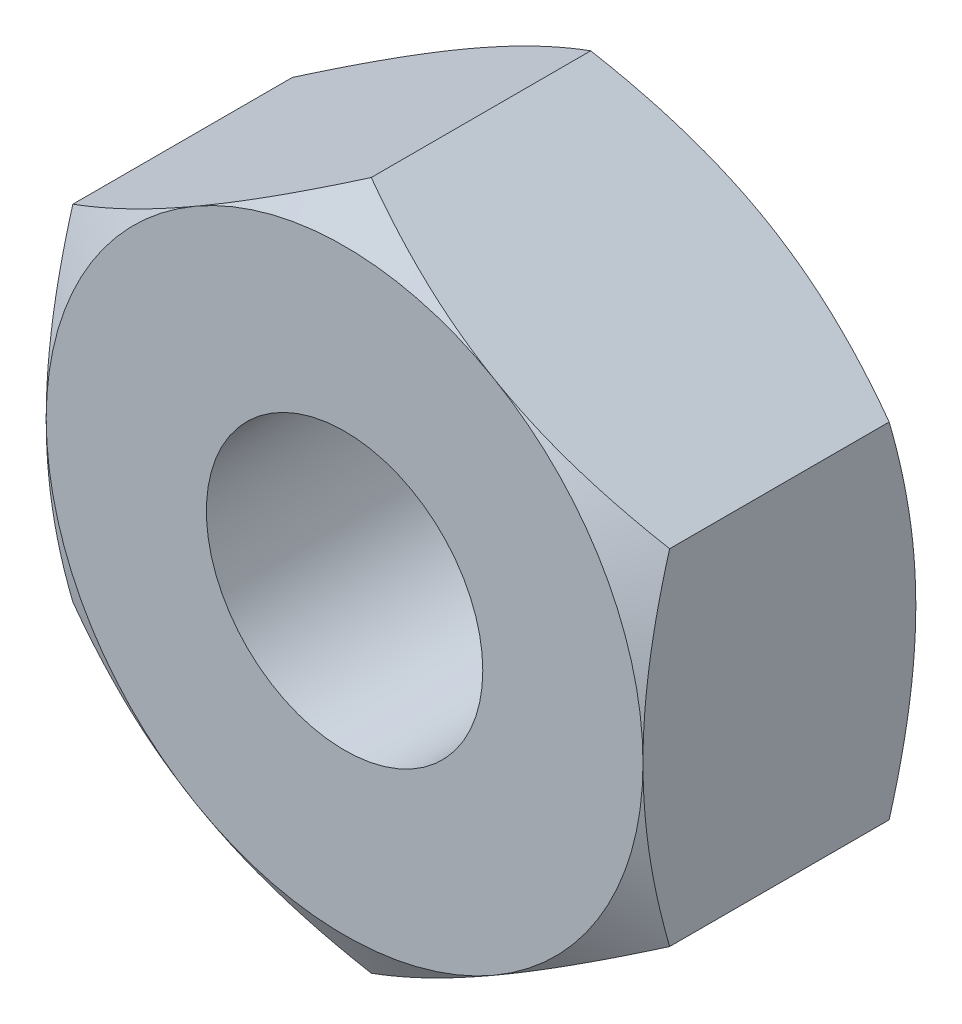
ISO-10303-21;
HEADER;
FILE_DESCRIPTION(('STEP AP214'),'2;1');
FILE_NAME('part.step','',(''),(''),'','','');
FILE_SCHEMA(('AUTOMOTIVE_DESIGN { 1 0 10303 214 1 1 1 1 }'));
ENDSEC;
DATA;
#1=APPLICATION_CONTEXT('core data for automotive mechanical design processes');
#2=APPLICATION_PROTOCOL_DEFINITION('international standard','automotive_design',2000,#1);
#3=PRODUCT_CONTEXT('',#1,'mechanical');
#4=PRODUCT('Part','Part','',(#3));
#5=PRODUCT_RELATED_PRODUCT_CATEGORY('part','',(#4));
#6=PRODUCT_DEFINITION_FORMATION('','',#4);
#7=PRODUCT_DEFINITION_CONTEXT('part definition',#1,'design');
#8=PRODUCT_DEFINITION('design','',#6,#7);
#9=PRODUCT_DEFINITION_SHAPE('','',#8);
#10=(LENGTH_UNIT() NAMED_UNIT(*) SI_UNIT(.MILLI.,.METRE.));
#11=(NAMED_UNIT(*) PLANE_ANGLE_UNIT() SI_UNIT($,.RADIAN.));
#12=(NAMED_UNIT(*) SI_UNIT($,.STERADIAN.) SOLID_ANGLE_UNIT());
#13=UNCERTAINTY_MEASURE_WITH_UNIT(LENGTH_MEASURE(1.E-05),#10,'distance_accuracy_value','');
#14=(GEOMETRIC_REPRESENTATION_CONTEXT(3) GLOBAL_UNCERTAINTY_ASSIGNED_CONTEXT((#13)) GLOBAL_UNIT_ASSIGNED_CONTEXT((#10,
#11,#12)) REPRESENTATION_CONTEXT('',''));
#15=CARTESIAN_POINT('',(0.,0.,0.));
#16=DIRECTION('',(0.,0.,1.));
#17=DIRECTION('',(1.,0.,0.));
#18=AXIS2_PLACEMENT_3D('',#15,#16,#17);
#19=CARTESIAN_POINT('',(3.50000000000002,2.02072594216371,3.2));
#20=DIRECTION('',(-0.499999999999991,-0.866025403784444,0.));
#21=DIRECTION('',(0.866025403784444,-0.499999999999991,0.));
#22=AXIS2_PLACEMENT_3D('',#19,#20,#21);
#23=PLANE('',#22);
#24=CARTESIAN_POINT('',(3.50020000000002,2.02061047210987,2.88732593930662));
#25=CARTESIAN_POINT('',(3.34639282154757,2.10941108799268,2.93861421101));
#26=CARTESIAN_POINT('',(3.1912579891656,2.1989782252291,2.98525904618379));
#27=CARTESIAN_POINT('',(2.87830199342324,2.37966345361546,3.06667812446664));
#28=CARTESIAN_POINT('',(2.72047526921252,2.47078475532383,3.10142356441543));
#29=CARTESIAN_POINT('',(2.40677778961988,2.65189807961074,3.15550997281716));
#30=CARTESIAN_POINT('',(2.25095530083932,2.741862235454,3.17521091373961));
#31=CARTESIAN_POINT('',(1.93857711279463,2.92221386641056,3.19872986726274));
#32=CARTESIAN_POINT('',(1.78202254896577,3.01260068598001,3.20256735545443));
#33=CARTESIAN_POINT('',(1.48949078007901,3.1814939814933,3.19458469812302));
#34=CARTESIAN_POINT('',(1.3534697875421,3.26002573814993,3.1847245659304));
#35=CARTESIAN_POINT('',(1.08231397971101,3.41657761679353,3.1534735331006));
#36=CARTESIAN_POINT('',(0.947180102315319,3.49459719728457,3.13207195671421));
#37=CARTESIAN_POINT('',(0.675465207594818,3.65147186489428,3.07856959211943));
#38=CARTESIAN_POINT('',(0.538918580721666,3.73030709667643,3.04624200555492));
#39=CARTESIAN_POINT('',(0.267861907055499,3.88680174018323,2.97287106619202));
#40=CARTESIAN_POINT('',(0.133348387531464,3.96446315689007,2.93184495343015));
#41=CARTESIAN_POINT('',(-0.0001999999999996,4.0415673543812,2.88732593930664));
#42=B_SPLINE_CURVE_WITH_KNOTS('',3,(#24,#25,#26,#27,#28,#29,#30,#31,#32,#33,#34,#35,#36,#37,#38,
#39,#40,#41),.UNSPECIFIED.,.F.,.F.,(4,2,2,2,2,2,2,2,4),(0.,0.554793832886257,1.11092123814984,
1.6532846708322,2.19498204478404,2.66665130850861,3.13875761298268,3.6213361260051,
4.10296698719187),.UNSPECIFIED.);
#43=CARTESIAN_POINT('',(3.50000000000002,2.02072594216371,2.88739260883034));
#44=VERTEX_POINT('',#43);
#45=CARTESIAN_POINT('',(1.74999999999997,3.03108891324556,3.2));
#46=VERTEX_POINT('',#45);
#47=EDGE_CURVE('E65',#44,#46,#42,.T.);
#48=ORIENTED_EDGE('',*,*,#47,.F.);
#49=DIRECTION('',(0.,0.,-1.));
#50=VECTOR('',#49,1.);
#51=CARTESIAN_POINT('',(3.50000000000002,2.02072594216371,3.2));
#52=LINE('',#51,#50);
#53=CARTESIAN_POINT('',(3.50000000000002,2.02072594216371,0.312607391169656));
#54=VERTEX_POINT('',#53);
#55=EDGE_CURVE('E304',#44,#54,#52,.T.);
#56=ORIENTED_EDGE('',*,*,#55,.T.);
#57=CARTESIAN_POINT('',(-0.000199999999999895,4.0415673543812,0.312674060693357));
#58=CARTESIAN_POINT('',(0.15360717845245,3.95276673849838,0.261385788989971));
#59=CARTESIAN_POINT('',(0.308742010834425,3.86319960126196,0.214740953816186));
#60=CARTESIAN_POINT('',(0.621698006576783,3.68251437287561,0.13332187553334));
#61=CARTESIAN_POINT('',(0.779524730787498,3.59139307116724,0.0985764355845542));
#62=CARTESIAN_POINT('',(1.09322221038013,3.41027974688033,0.0444900271828316));
#63=CARTESIAN_POINT('',(1.24904469916069,3.32031559103708,0.0247890862603784));
#64=CARTESIAN_POINT('',(1.56142288720538,3.13996396008052,0.00127013273725365));
#65=CARTESIAN_POINT('',(1.71797745103423,3.04957714051106,-0.00256735545443443));
#66=CARTESIAN_POINT('',(2.010509219921,2.88068384499778,0.00541530187698012));
#67=CARTESIAN_POINT('',(2.14653021245791,2.80215208834115,0.0152754340696107));
#68=CARTESIAN_POINT('',(2.41768602028901,2.64560020969754,0.0465264668994092));
#69=CARTESIAN_POINT('',(2.5528198976847,2.5675806292065,0.0679280432858048));
#70=CARTESIAN_POINT('',(2.8245347924052,2.41070596159679,0.121430407880586));
#71=CARTESIAN_POINT('',(2.96108141927835,2.33187072981465,0.153757994445096));
#72=CARTESIAN_POINT('',(3.23213809294452,2.17537608630784,0.227128933808006));
#73=CARTESIAN_POINT('',(3.36665161246856,2.097714669601,0.268155046569879));
#74=CARTESIAN_POINT('',(3.50020000000002,2.02061047210987,0.312674060693384));
#75=B_SPLINE_CURVE_WITH_KNOTS('',3,(#57,#58,#59,#60,#61,#62,#63,#64,#65,#66,#67,#68,#69,#70,#71,
#72,#73,#74),.UNSPECIFIED.,.F.,.F.,(4,2,2,2,2,2,2,2,4),(0.,0.554793832886251,1.11092123814983,
1.65328467083218,2.19498204478402,2.66665130850859,3.13875761298267,3.6213361260051,
4.10296698719188),.UNSPECIFIED.);
#76=CARTESIAN_POINT('',(1.74999999999997,3.03108891324556,0.));
#77=VERTEX_POINT('',#76);
#78=EDGE_CURVE('E240',#77,#54,#75,.T.);
#79=ORIENTED_EDGE('',*,*,#78,.F.);
#80=CARTESIAN_POINT('',(0.,4.04145188432736,0.312607391169629));
#81=VERTEX_POINT('',#80);
#82=EDGE_CURVE('E258',#81,#77,#75,.T.);
#83=ORIENTED_EDGE('',*,*,#82,.F.);
#84=DIRECTION('',(0.,0.,-1.));
#85=VECTOR('',#84,1.);
#86=CARTESIAN_POINT('',(0.,4.04145188432736,3.2));
#87=LINE('',#86,#85);
#88=CARTESIAN_POINT('',(0.,4.04145188432736,2.88739260883037));
#89=VERTEX_POINT('',#88);
#90=EDGE_CURVE('E271',#89,#81,#87,.T.);
#91=ORIENTED_EDGE('',*,*,#90,.F.);
#92=EDGE_CURVE('E286',#46,#89,#42,.T.);
#93=ORIENTED_EDGE('',*,*,#92,.F.);
#94=EDGE_LOOP('',(#48,#56,#79,#83,#91,#93));
#95=FACE_BOUND('',#94,.T.);
#96=ADVANCED_FACE('F42',(#95),#23,.F.);
#97=CARTESIAN_POINT('',(0.,4.04145188432736,3.2));
#98=DIRECTION('',(0.499999999999995,-0.866025403784441,0.));
#99=DIRECTION('',(0.866025403784441,0.499999999999996,0.));
#100=AXIS2_PLACEMENT_3D('',#97,#98,#99);
#101=PLANE('',#100);
#102=CARTESIAN_POINT('',(0.000200000000000068,4.0415673543812,2.88732593930664));
#103=CARTESIAN_POINT('',(-0.153607178452449,3.95276673849838,2.93861421101003));
#104=CARTESIAN_POINT('',(-0.308742010834424,3.86319960126196,2.98525904618381));
#105=CARTESIAN_POINT('',(-0.621698006576781,3.68251437287561,3.06667812446666));
#106=CARTESIAN_POINT('',(-0.779524730787495,3.59139307116724,3.10142356441545));
#107=CARTESIAN_POINT('',(-1.09322221038013,3.41027974688033,3.15550997281717));
#108=CARTESIAN_POINT('',(-1.24904469916069,3.32031559103707,3.17521091373963));
#109=CARTESIAN_POINT('',(-1.56142288720537,3.13996396008051,3.19872986726275));
#110=CARTESIAN_POINT('',(-1.71797745103423,3.04957714051106,3.20256735545444));
#111=CARTESIAN_POINT('',(-2.01050921992099,2.88068384499777,3.19458469812303));
#112=CARTESIAN_POINT('',(-2.14653021245791,2.80215208834114,3.1847245659304));
#113=CARTESIAN_POINT('',(-2.41768602028899,2.64560020969753,3.1534735331006));
#114=CARTESIAN_POINT('',(-2.55281989768468,2.5675806292065,3.1320719567142));
#115=CARTESIAN_POINT('',(-2.82453479240518,2.41070596159678,3.07856959211942));
#116=CARTESIAN_POINT('',(-2.96108141927834,2.33187072981464,3.04624200555491));
#117=CARTESIAN_POINT('',(-3.2321380929445,2.17537608630783,2.97287106619201));
#118=CARTESIAN_POINT('',(-3.36665161246854,2.09771466960099,2.93184495343013));
#119=CARTESIAN_POINT('',(-3.5002,2.02061047210986,2.88732593930663));
#120=B_SPLINE_CURVE_WITH_KNOTS('',3,(#102,#103,#104,#105,#106,#107,#108,#109,#110,#111,#112,
#113,#114,#115,#116,#117,#118,#119),.UNSPECIFIED.,.F.,.F.,(4,2,2,2,2,2,2,2,4),(0.,
0.554793832886251,1.11092123814983,1.65328467083218,2.19498204478402,2.66665130850859,
3.13875761298266,3.62133612600509,4.10296698719186),.UNSPECIFIED.);
#121=CARTESIAN_POINT('',(-1.74999999999999,3.03108891324555,3.2));
#122=VERTEX_POINT('',#121);
#123=EDGE_CURVE('E58',#89,#122,#120,.T.);
#124=ORIENTED_EDGE('',*,*,#123,.F.);
#125=ORIENTED_EDGE('',*,*,#90,.T.);
#126=CARTESIAN_POINT('',(-3.5002,2.02061047210986,0.31267406069337));
#127=CARTESIAN_POINT('',(-3.34639282154755,2.10941108799268,0.261385788989983));
#128=CARTESIAN_POINT('',(-3.19125798916558,2.19897822522909,0.214740953816196));
#129=CARTESIAN_POINT('',(-2.87830199342322,2.37966345361545,0.133321875533347));
#130=CARTESIAN_POINT('',(-2.7204752692125,2.47078475532382,0.0985764355845596));
#131=CARTESIAN_POINT('',(-2.40677778961987,2.65189807961073,0.0444900271828333));
#132=CARTESIAN_POINT('',(-2.25095530083931,2.74186223545399,0.0247890862603783));
#133=CARTESIAN_POINT('',(-1.93857711279462,2.92221386641055,0.0012701327372501));
#134=CARTESIAN_POINT('',(-1.78202254896577,3.01260068598001,-0.00256735545443954));
#135=CARTESIAN_POINT('',(-1.48949078007901,3.18149398149329,0.00541530187697198));
#136=CARTESIAN_POINT('',(-1.35346978754209,3.26002573814992,0.0152754340696009));
#137=CARTESIAN_POINT('',(-1.082313979711,3.41657761679353,0.0465264668993961));
#138=CARTESIAN_POINT('',(-0.947180102315315,3.49459719728456,0.06792804328579));
#139=CARTESIAN_POINT('',(-0.675465207594815,3.65147186489428,0.121430407880567));
#140=CARTESIAN_POINT('',(-0.538918580721663,3.73030709667642,0.153757994445076));
#141=CARTESIAN_POINT('',(-0.267861907055498,3.88680174018323,0.227128933807982));
#142=CARTESIAN_POINT('',(-0.133348387531463,3.96446315689007,0.268155046569854));
#143=CARTESIAN_POINT('',(0.000200000000000403,4.0415673543812,0.312674060693358));
#144=B_SPLINE_CURVE_WITH_KNOTS('',3,(#126,#127,#128,#129,#130,#131,#132,#133,#134,#135,#136,
#137,#138,#139,#140,#141,#142,#143),.UNSPECIFIED.,.F.,.F.,(4,2,2,2,2,2,2,2,4),(0.,
0.554793832886254,1.11092123814984,1.65328467083219,2.19498204478403,2.6666513085086,
3.13875761298267,3.62133612600509,4.10296698719186),.UNSPECIFIED.);
#145=CARTESIAN_POINT('',(-1.74999999999998,3.03108891324554,0.));
#146=VERTEX_POINT('',#145);
#147=EDGE_CURVE('E202',#146,#81,#144,.T.);
#148=ORIENTED_EDGE('',*,*,#147,.F.);
#149=CARTESIAN_POINT('',(-3.5,2.02072594216369,0.312607391169643));
#150=VERTEX_POINT('',#149);
#151=EDGE_CURVE('E257',#150,#146,#144,.T.);
#152=ORIENTED_EDGE('',*,*,#151,.F.);
#153=DIRECTION('',(0.,0.,-1.));
#154=VECTOR('',#153,1.);
#155=CARTESIAN_POINT('',(-3.5,2.0207259421637,3.2));
#156=LINE('',#155,#154);
#157=CARTESIAN_POINT('',(-3.5,2.0207259421637,2.88739260883036));
#158=VERTEX_POINT('',#157);
#159=EDGE_CURVE('E295',#158,#150,#156,.T.);
#160=ORIENTED_EDGE('',*,*,#159,.F.);
#161=EDGE_CURVE('E137',#122,#158,#120,.T.);
#162=ORIENTED_EDGE('',*,*,#161,.F.);
#163=EDGE_LOOP('',(#124,#125,#148,#152,#160,#162));
#164=FACE_BOUND('',#163,.T.);
#165=ADVANCED_FACE('F186',(#164),#101,.F.);
#166=CARTESIAN_POINT('',(-3.5,2.0207259421637,3.2));
#167=DIRECTION('',(1.,0.,0.));
#168=DIRECTION('',(0.,1.,0.));
#169=AXIS2_PLACEMENT_3D('',#166,#167,#168);
#170=PLANE('',#169);
#171=CARTESIAN_POINT('',(-3.49999999999998,-5.5274755281958,1.44347007249662));
#172=CARTESIAN_POINT('',(-3.49999999999998,-5.37372622942806,1.51844717307556));
#173=CARTESIAN_POINT('',(-3.49999999999998,-5.2196344657417,1.59273353415013));
#174=CARTESIAN_POINT('',(-3.49999999999998,-4.91058421754996,1.73953812245554));
#175=CARTESIAN_POINT('',(-3.49999999999998,-4.75562560943091,1.81205608917758));
#176=CARTESIAN_POINT('',(-3.49999999999998,-4.44390840933384,1.95528096830741));
#177=CARTESIAN_POINT('',(-3.49999999999998,-4.28714466296956,2.02597669970993));
#178=CARTESIAN_POINT('',(-3.49999999999998,-3.97240446581533,2.16460453031009));
#179=CARTESIAN_POINT('',(-3.49999999999998,-3.81442806995853,2.23253675382692));
#180=CARTESIAN_POINT('',(-3.49999999999998,-3.49158188309475,2.36717547077697));
#181=CARTESIAN_POINT('',(-3.49999999999998,-3.32666117073996,2.43376050209091));
#182=CARTESIAN_POINT('',(-3.49999999999999,-2.99492744280665,2.5621279710108));
#183=CARTESIAN_POINT('',(-3.49999999999999,-2.82811422277033,2.6239098839377));
#184=CARTESIAN_POINT('',(-3.49999999999999,-2.49261126726259,2.74112201247845));
#185=CARTESIAN_POINT('',(-3.49999999999999,-2.32392577723557,2.79656426257449));
#186=CARTESIAN_POINT('',(-3.49999999999999,-1.98413704064268,2.89938430337881));
#187=CARTESIAN_POINT('',(-3.49999999999999,-1.81303454151602,2.94676453052719));
#188=CARTESIAN_POINT('',(-3.49999999999999,-1.46926530405379,3.03100086845278));
#189=CARTESIAN_POINT('',(-3.49999999999999,-1.296613407194,3.06791646176417));
#190=CARTESIAN_POINT('',(-3.49999999999999,-0.949062219267497,3.12920355544621));
#191=CARTESIAN_POINT('',(-3.49999999999999,-0.774163178767844,3.1535764421568));
#192=CARTESIAN_POINT('',(-3.49999999999999,-0.425315012837556,3.18752012223861));
#193=CARTESIAN_POINT('',(-3.49999999999999,-0.251385641598625,3.19728891338473));
#194=CARTESIAN_POINT('',(-3.5,0.0966848827766961,3.20172425462782));
#195=CARTESIAN_POINT('',(-3.5,0.270826038538338,3.19639061557001));
#196=CARTESIAN_POINT('',(-3.5,0.563556219191337,3.17511676381855));
#197=CARTESIAN_POINT('',(-3.5,0.682444447104659,3.1630262795363));
#198=CARTESIAN_POINT('',(-3.5,0.919409772611291,3.13250644883794));
#199=CARTESIAN_POINT('',(-3.5,1.03748676882481,3.11407632434138));
#200=CARTESIAN_POINT('',(-3.5,1.39030731524239,3.05023917047794));
#201=CARTESIAN_POINT('',(-3.5,1.62352663458402,2.99629478055012));
#202=CARTESIAN_POINT('',(-3.5,1.97246374212529,2.90198374629423));
#203=CARTESIAN_POINT('',(-3.5,2.08996778731763,2.86784291317552));
#204=CARTESIAN_POINT('',(-3.5,2.3238363192327,2.79582473258671));
#205=CARTESIAN_POINT('',(-3.5,2.44020079699526,2.75794735576287));
#206=CARTESIAN_POINT('',(-3.50000000000001,2.67182485902198,2.67907960956254));
#207=CARTESIAN_POINT('',(-3.50000000000001,2.78708473483684,2.63809008860559));
#208=CARTESIAN_POINT('',(-3.50000000000001,3.01663563833894,2.55349925249792));
#209=CARTESIAN_POINT('',(-3.50000000000001,3.13092668947534,2.50989800076802));
#210=CARTESIAN_POINT('',(-3.50000000000001,3.4424238711739,2.38763495015914));
#211=CARTESIAN_POINT('',(-3.50000000000001,3.63876810673243,2.3067791538002));
#212=CARTESIAN_POINT('',(-3.50000000000001,4.02939361773507,2.14021128017685));
#213=CARTESIAN_POINT('',(-3.50000000000001,4.2236746469157,2.05449863076716));
#214=CARTESIAN_POINT('',(-3.50000000000001,4.61064862479033,1.87938669166087));
#215=CARTESIAN_POINT('',(-3.50000000000001,4.80334096212261,1.78998605555322));
#216=CARTESIAN_POINT('',(-3.50000000000001,5.18740432133651,1.60838432232883));
#217=CARTESIAN_POINT('',(-3.50000000000001,5.37877530077497,1.51618313576483));
#218=CARTESIAN_POINT('',(-3.50000000000002,5.76076297601776,1.32945163217988));
#219=CARTESIAN_POINT('',(-3.50000000000002,5.95137792730074,1.23491775396072));
#220=CARTESIAN_POINT('',(-3.50000000000002,6.33174098662072,1.04412006233259));
#221=CARTESIAN_POINT('',(-3.50000000000002,6.52148908521012,0.947856230125409));
#222=CARTESIAN_POINT('',(-3.50000000000002,7.08958847589595,0.657050938640543));
#223=CARTESIAN_POINT('',(-3.50000000000002,7.46688549599338,0.460450936602844));
#224=CARTESIAN_POINT('',(-3.50000000000002,8.17883115472204,0.0850737052660838));
#225=CARTESIAN_POINT('',(-3.50000000000003,8.5136774682376,-0.093330448390855));
#226=CARTESIAN_POINT('',(-3.50000000000003,9.18225339251813,-0.452270184164183));
#227=CARTESIAN_POINT('',(-3.50000000000003,9.5159829287799,-0.63280590498313));
#228=CARTESIAN_POINT('',(-3.50000000000003,10.1814287091803,-0.994821508577032));
#229=CARTESIAN_POINT('',(-3.50000000000003,10.5131479214205,-1.17629594407262));
#230=CARTESIAN_POINT('',(-3.50000000000003,11.1758898576765,-1.54044809319759));
#231=CARTESIAN_POINT('',(-3.50000000000004,11.5069126369099,-1.7231257062923));
#232=CARTESIAN_POINT('',(-3.50000000000004,11.8376919189626,-1.90624045241287));
#233=B_SPLINE_CURVE_WITH_KNOTS('',3,(#171,#172,#173,#174,#175,#176,#177,#178,#179,#180,#181,
#182,#183,#184,#185,#186,#187,#188,#189,#190,#191,#192,#193,#194,#195,#196,#197,#198,#199,#200,
#201,#202,#203,#204,#205,#206,#207,#208,#209,#210,#211,#212,#213,#214,#215,#216,#217,#218,#219,
#220,#221,#222,#223,#224,#225,#226,#227,#228,#229,#230,#231,#232),.UNSPECIFIED.,.F.,.F.,(4,2,2,
2,2,2,2,2,2,2,2,2,2,2,2,2,2,2,2,2,2,2,2,2,2,2,2,2,2,2,4),(0.,0.513176065968777,1.02642727863608,
1.54230782313467,2.0581651345032,2.59167231100649,3.12523768467524,3.65777276764035,
4.1901466251637,4.71943076454303,5.24865638980308,5.77063972476674,6.29262959749126,
6.65096196839927,7.00933833406707,7.72643202890318,8.09348824670022,8.4605473482654,
8.82750674056805,9.19445722558126,9.83138168024823,10.4683813222797,11.1056156148603,
11.7428702816196,12.3811667165831,13.0194700916665,14.2957736419783,15.4339885701988,
16.5722779755783,17.7066189546709,18.8408663239038),.UNSPECIFIED.);
#234=CARTESIAN_POINT('',(-3.5,0.,3.2));
#235=VERTEX_POINT('',#234);
#236=EDGE_CURVE('E131',#158,#235,#233,.F.);
#237=ORIENTED_EDGE('',*,*,#236,.F.);
#238=ORIENTED_EDGE('',*,*,#159,.T.);
#239=CARTESIAN_POINT('',(-3.49999999999998,-5.5274755281958,1.75652992750338));
#240=CARTESIAN_POINT('',(-3.49999999999998,-5.37372622942806,1.68155282692444));
#241=CARTESIAN_POINT('',(-3.49999999999998,-5.2196344657417,1.60726646584987));
#242=CARTESIAN_POINT('',(-3.49999999999998,-4.91058421754996,1.46046187754447));
#243=CARTESIAN_POINT('',(-3.49999999999998,-4.75562560943091,1.38794391082242));
#244=CARTESIAN_POINT('',(-3.49999999999998,-4.44390840933384,1.24471903169259));
#245=CARTESIAN_POINT('',(-3.49999999999998,-4.28714466296956,1.17402330029007));
#246=CARTESIAN_POINT('',(-3.49999999999998,-3.97240446581533,1.03539546968991));
#247=CARTESIAN_POINT('',(-3.49999999999998,-3.81442806995853,0.967463246173076));
#248=CARTESIAN_POINT('',(-3.49999999999998,-3.49158188309474,0.832824529223031));
#249=CARTESIAN_POINT('',(-3.49999999999998,-3.32666117073995,0.766239497909093));
#250=CARTESIAN_POINT('',(-3.49999999999999,-2.99492744280664,0.637872028989194));
#251=CARTESIAN_POINT('',(-3.49999999999999,-2.82811422277033,0.576090116062302));
#252=CARTESIAN_POINT('',(-3.49999999999999,-2.49261126726259,0.45887798752155));
#253=CARTESIAN_POINT('',(-3.49999999999999,-2.32392577723557,0.403435737425511));
#254=CARTESIAN_POINT('',(-3.49999999999999,-1.98413704064268,0.300615696621188));
#255=CARTESIAN_POINT('',(-3.49999999999999,-1.81303454151602,0.253235469472808));
#256=CARTESIAN_POINT('',(-3.49999999999999,-1.46926530405379,0.16899913154722));
#257=CARTESIAN_POINT('',(-3.49999999999999,-1.29661340719399,0.132083538235825));
#258=CARTESIAN_POINT('',(-3.49999999999999,-0.949062219267496,0.0707964445537896));
#259=CARTESIAN_POINT('',(-3.49999999999999,-0.774163178767844,0.0464235578432014));
#260=CARTESIAN_POINT('',(-3.49999999999999,-0.425315012837556,0.012479877761386));
#261=CARTESIAN_POINT('',(-3.49999999999999,-0.251385641598625,0.00271108661527034));
#262=CARTESIAN_POINT('',(-3.5,0.0966848827766967,-0.00172425462781566));
#263=CARTESIAN_POINT('',(-3.5,0.270826038538338,0.00360938442998938));
#264=CARTESIAN_POINT('',(-3.5,0.563556219191337,0.0248832361814537));
#265=CARTESIAN_POINT('',(-3.5,0.68244444710466,0.0369737204636969));
#266=CARTESIAN_POINT('',(-3.5,0.919409772611292,0.0674935511620587));
#267=CARTESIAN_POINT('',(-3.5,1.03748676882481,0.0859236756586205));
#268=CARTESIAN_POINT('',(-3.5,1.39030731524239,0.149760829522062));
#269=CARTESIAN_POINT('',(-3.5,1.62352663458402,0.203705219449886));
#270=CARTESIAN_POINT('',(-3.5,1.97246374212529,0.29801625370577));
#271=CARTESIAN_POINT('',(-3.5,2.08996778731763,0.332157086824476));
#272=CARTESIAN_POINT('',(-3.5,2.3238363192327,0.404175267413294));
#273=CARTESIAN_POINT('',(-3.5,2.44020079699526,0.442052644237132));
#274=CARTESIAN_POINT('',(-3.50000000000001,2.67182485902198,0.52092039043746));
#275=CARTESIAN_POINT('',(-3.50000000000001,2.78708473483684,0.561909911394407));
#276=CARTESIAN_POINT('',(-3.50000000000001,3.01663563833894,0.64650074750208));
#277=CARTESIAN_POINT('',(-3.50000000000001,3.13092668947534,0.690101999231977));
#278=CARTESIAN_POINT('',(-3.50000000000001,3.4424238711739,0.81236504984086));
#279=CARTESIAN_POINT('',(-3.50000000000001,3.63876810673244,0.893220846199796));
#280=CARTESIAN_POINT('',(-3.50000000000001,4.02939361773507,1.05978871982315));
#281=CARTESIAN_POINT('',(-3.50000000000001,4.2236746469157,1.14550136923284));
#282=CARTESIAN_POINT('',(-3.50000000000001,4.61064862479032,1.32061330833913));
#283=CARTESIAN_POINT('',(-3.50000000000001,4.80334096212261,1.41001394444678));
#284=CARTESIAN_POINT('',(-3.50000000000001,5.18740432133651,1.59161567767117));
#285=CARTESIAN_POINT('',(-3.50000000000001,5.37877530077496,1.68381686423517));
#286=CARTESIAN_POINT('',(-3.50000000000002,5.76076297601776,1.87054836782012));
#287=CARTESIAN_POINT('',(-3.50000000000002,5.95137792730074,1.96508224603928));
#288=CARTESIAN_POINT('',(-3.50000000000002,6.33174098662072,2.15587993766741));
#289=CARTESIAN_POINT('',(-3.50000000000002,6.52148908521011,2.25214376987459));
#290=CARTESIAN_POINT('',(-3.50000000000002,7.08958847589594,2.54294906135945));
#291=CARTESIAN_POINT('',(-3.50000000000002,7.46688549599337,2.73954906339715));
#292=CARTESIAN_POINT('',(-3.50000000000002,8.17883115472203,3.11492629473391));
#293=CARTESIAN_POINT('',(-3.50000000000003,8.51367746823759,3.29333044839085));
#294=CARTESIAN_POINT('',(-3.50000000000003,9.18225339251812,3.65227018416418));
#295=CARTESIAN_POINT('',(-3.50000000000003,9.5159829287799,3.83280590498313));
#296=CARTESIAN_POINT('',(-3.50000000000003,10.1814287091803,4.19482150857703));
#297=CARTESIAN_POINT('',(-3.50000000000003,10.5131479214205,4.37629594407262));
#298=CARTESIAN_POINT('',(-3.50000000000003,11.1758898576765,4.74044809319759));
#299=CARTESIAN_POINT('',(-3.50000000000004,11.5069126369099,4.9231257062923));
#300=CARTESIAN_POINT('',(-3.50000000000004,11.8376919189626,5.10624045241287));
#301=B_SPLINE_CURVE_WITH_KNOTS('',3,(#239,#240,#241,#242,#243,#244,#245,#246,#247,#248,#249,
#250,#251,#252,#253,#254,#255,#256,#257,#258,#259,#260,#261,#262,#263,#264,#265,#266,#267,#268,
#269,#270,#271,#272,#273,#274,#275,#276,#277,#278,#279,#280,#281,#282,#283,#284,#285,#286,#287,
#288,#289,#290,#291,#292,#293,#294,#295,#296,#297,#298,#299,#300),.UNSPECIFIED.,.F.,.F.,(4,2,2,
2,2,2,2,2,2,2,2,2,2,2,2,2,2,2,2,2,2,2,2,2,2,2,2,2,2,2,4),(0.,0.513176065968776,1.02642727863608,
1.54230782313467,2.0581651345032,2.59167231100649,3.12523768467525,3.65777276764036,
4.1901466251637,4.71943076454303,5.24865638980308,5.77063972476674,6.29262959749127,
6.65096196839927,7.00933833406707,7.72643202890318,8.09348824670022,8.4605473482654,
8.82750674056805,9.19445722558126,9.83138168024824,10.4683813222797,11.1056156148603,
11.7428702816196,12.3811667165831,13.0194700916665,14.2957736419783,15.4339885701988,
16.5722779755783,17.7066189546709,18.8408663239038),.UNSPECIFIED.);
#302=CARTESIAN_POINT('',(-3.5,0.,0.));
#303=VERTEX_POINT('',#302);
#304=EDGE_CURVE('E192',#303,#150,#301,.T.);
#305=ORIENTED_EDGE('',*,*,#304,.F.);
#306=CARTESIAN_POINT('',(-3.49999999999999,-2.02072594216372,0.312607391169643));
#307=VERTEX_POINT('',#306);
#308=EDGE_CURVE('E200',#307,#303,#301,.T.);
#309=ORIENTED_EDGE('',*,*,#308,.F.);
#310=DIRECTION('',(0.,0.,-1.));
#311=VECTOR('',#310,1.);
#312=CARTESIAN_POINT('',(-3.49999999999999,-2.02072594216372,3.2));
#313=LINE('',#312,#311);
#314=CARTESIAN_POINT('',(-3.49999999999999,-2.02072594216372,2.88739260883036));
#315=VERTEX_POINT('',#314);
#316=EDGE_CURVE('E159',#315,#307,#313,.T.);
#317=ORIENTED_EDGE('',*,*,#316,.F.);
#318=EDGE_CURVE('E141',#235,#315,#233,.F.);
#319=ORIENTED_EDGE('',*,*,#318,.F.);
#320=EDGE_LOOP('',(#237,#238,#305,#309,#317,#319));
#321=FACE_BOUND('',#320,.T.);
#322=ADVANCED_FACE('F157',(#321),#170,.F.);
#323=CARTESIAN_POINT('',(-3.49999999999999,-2.02072594216372,3.2));
#324=DIRECTION('',(0.499999999999997,0.866025403784441,0.));
#325=DIRECTION('',(-0.866025403784441,0.499999999999997,0.));
#326=AXIS2_PLACEMENT_3D('',#323,#324,#325);
#327=PLANE('',#326);
#328=CARTESIAN_POINT('',(-3.50019999999999,-2.02061047210988,2.88732593930663));
#329=CARTESIAN_POINT('',(-3.34639282154754,-2.1094110879927,2.93861421101002));
#330=CARTESIAN_POINT('',(-3.19125798916556,-2.19897822522912,2.9852590461838));
#331=CARTESIAN_POINT('',(-2.87830199342321,-2.37966345361548,3.06667812446665));
#332=CARTESIAN_POINT('',(-2.72047526921249,-2.47078475532385,3.10142356441544));
#333=CARTESIAN_POINT('',(-2.40677778961986,-2.65189807961076,3.15550997281716));
#334=CARTESIAN_POINT('',(-2.25095530083929,-2.74186223545402,3.17521091373961));
#335=CARTESIAN_POINT('',(-1.93857711279461,-2.92221386641058,3.19872986726274));
#336=CARTESIAN_POINT('',(-1.78202254896575,-3.01260068598003,3.20256735545443));
#337=CARTESIAN_POINT('',(-1.48949078007899,-3.18149398149332,3.19458469812302));
#338=CARTESIAN_POINT('',(-1.35346978754208,-3.26002573814995,3.18472456593039));
#339=CARTESIAN_POINT('',(-1.08231397971099,-3.41657761679356,3.15347353310059));
#340=CARTESIAN_POINT('',(-0.947180102315303,-3.49459719728459,3.1320719567142));
#341=CARTESIAN_POINT('',(-0.675465207594803,-3.6514718648943,3.07856959211942));
#342=CARTESIAN_POINT('',(-0.538918580721652,-3.73030709667645,3.04624200555491));
#343=CARTESIAN_POINT('',(-0.267861907055487,-3.88680174018325,2.972871066192));
#344=CARTESIAN_POINT('',(-0.133348387531453,-3.9644631568901,2.93184495343013));
#345=CARTESIAN_POINT('',(0.000200000000010199,-4.04156735438123,2.88732593930663));
#346=B_SPLINE_CURVE_WITH_KNOTS('',3,(#328,#329,#330,#331,#332,#333,#334,#335,#336,#337,#338,
#339,#340,#341,#342,#343,#344,#345),.UNSPECIFIED.,.F.,.F.,(4,2,2,2,2,2,2,2,4),(0.,
0.554793832886254,1.11092123814984,1.65328467083219,2.19498204478403,2.6666513085086,
3.13875761298267,3.62133612600509,4.10296698719186),.UNSPECIFIED.);
#347=CARTESIAN_POINT('',(-1.74999999999999,-3.03108891324554,3.2));
#348=VERTEX_POINT('',#347);
#349=EDGE_CURVE('E148',#315,#348,#346,.T.);
#350=ORIENTED_EDGE('',*,*,#349,.F.);
#351=ORIENTED_EDGE('',*,*,#316,.T.);
#352=CARTESIAN_POINT('',(0.000200000000010408,-4.04156735438123,0.312674060693374));
#353=CARTESIAN_POINT('',(-0.15360717845244,-3.95276673849841,0.261385788989986));
#354=CARTESIAN_POINT('',(-0.308742010834415,-3.86319960126199,0.2147409538162));
#355=CARTESIAN_POINT('',(-0.621698006576774,-3.68251437287563,0.133321875533352));
#356=CARTESIAN_POINT('',(-0.77952473078749,-3.59139307116726,0.098576435584565));
#357=CARTESIAN_POINT('',(-1.09322221038012,-3.41027974688035,0.0444900271828401));
#358=CARTESIAN_POINT('',(-1.24904469916069,-3.32031559103709,0.0247890862603856));
#359=CARTESIAN_POINT('',(-1.56142288720537,-3.13996396008053,0.00127013273725878));
#360=CARTESIAN_POINT('',(-1.71797745103423,-3.04957714051107,-0.00256735545443004));
#361=CARTESIAN_POINT('',(-2.01050921992099,-2.88068384499779,0.00541530187698266));
#362=CARTESIAN_POINT('',(-2.1465302124579,-2.80215208834116,0.0152754340696119));
#363=CARTESIAN_POINT('',(-2.41768602028899,-2.64560020969755,0.0465264668994081));
#364=CARTESIAN_POINT('',(-2.55281989768468,-2.56758062920652,0.0679280432858025));
#365=CARTESIAN_POINT('',(-2.82453479240518,-2.41070596159681,0.121430407880581));
#366=CARTESIAN_POINT('',(-2.96108141927833,-2.33187072981466,0.15375799444509));
#367=CARTESIAN_POINT('',(-3.23213809294449,-2.17537608630786,0.227128933807995));
#368=CARTESIAN_POINT('',(-3.36665161246853,-2.09771466960101,0.268155046569867));
#369=CARTESIAN_POINT('',(-3.50019999999999,-2.02061047210988,0.31267406069337));
#370=B_SPLINE_CURVE_WITH_KNOTS('',3,(#352,#353,#354,#355,#356,#357,#358,#359,#360,#361,#362,
#363,#364,#365,#366,#367,#368,#369),.UNSPECIFIED.,.F.,.F.,(4,2,2,2,2,2,2,2,4),(0.,
0.554793832886255,1.11092123814984,1.65328467083219,2.19498204478404,2.6666513085086,
3.13875761298267,3.62133612600509,4.10296698719186),.UNSPECIFIED.);
#371=CARTESIAN_POINT('',(-1.74999999999999,-3.03108891324555,0.));
#372=VERTEX_POINT('',#371);
#373=EDGE_CURVE('E201',#372,#307,#370,.T.);
#374=ORIENTED_EDGE('',*,*,#373,.F.);
#375=CARTESIAN_POINT('',(0.,-4.04145188432739,0.312607391169646));
#376=VERTEX_POINT('',#375);
#377=EDGE_CURVE('E245',#376,#372,#370,.T.);
#378=ORIENTED_EDGE('',*,*,#377,.F.);
#379=DIRECTION('',(0.,0.,-1.));
#380=VECTOR('',#379,1.);
#381=CARTESIAN_POINT('',(0.,-4.04145188432739,3.2));
#382=LINE('',#381,#380);
#383=CARTESIAN_POINT('',(0.,-4.04145188432739,2.88739260883035));
#384=VERTEX_POINT('',#383);
#385=EDGE_CURVE('E300',#384,#376,#382,.T.);
#386=ORIENTED_EDGE('',*,*,#385,.F.);
#387=EDGE_CURVE('E160',#348,#384,#346,.T.);
#388=ORIENTED_EDGE('',*,*,#387,.F.);
#389=EDGE_LOOP('',(#350,#351,#374,#378,#386,#388));
#390=FACE_BOUND('',#389,.T.);
#391=ADVANCED_FACE('F185',(#390),#327,.F.);
#392=CARTESIAN_POINT('',(0.,-4.04145188432739,3.2));
#393=DIRECTION('',(-0.500000000000001,0.866025403784438,0.));
#394=DIRECTION('',(-0.866025403784438,-0.500000000000001,0.));
#395=AXIS2_PLACEMENT_3D('',#392,#393,#394);
#396=PLANE('',#395);
#397=CARTESIAN_POINT('',(-0.000199999999989673,-4.04156735438123,2.88732593930663));
#398=CARTESIAN_POINT('',(0.15360717845246,-3.95276673849841,2.93861421101001));
#399=CARTESIAN_POINT('',(0.308742010834435,-3.86319960126199,2.9852590461838));
#400=CARTESIAN_POINT('',(0.621698006576793,-3.68251437287563,3.06667812446665));
#401=CARTESIAN_POINT('',(0.779524730787508,-3.59139307116726,3.10142356441544));
#402=CARTESIAN_POINT('',(1.09322221038014,-3.41027974688034,3.15550997281716));
#403=CARTESIAN_POINT('',(1.2490446991607,-3.32031559103709,3.17521091373961));
#404=CARTESIAN_POINT('',(1.56142288720539,-3.13996396008052,3.19872986726274));
#405=CARTESIAN_POINT('',(1.71797745103424,-3.04957714051107,3.20256735545443));
#406=CARTESIAN_POINT('',(2.010509219921,-2.88068384499778,3.19458469812302));
#407=CARTESIAN_POINT('',(2.14653021245792,-2.80215208834115,3.18472456593039));
#408=CARTESIAN_POINT('',(2.41768602028901,-2.64560020969754,3.15347353310059));
#409=CARTESIAN_POINT('',(2.5528198976847,-2.5675806292065,3.1320719567142));
#410=CARTESIAN_POINT('',(2.8245347924052,-2.41070596159679,3.07856959211942));
#411=CARTESIAN_POINT('',(2.96108141927835,-2.33187072981464,3.04624200555491));
#412=CARTESIAN_POINT('',(3.23213809294452,-2.17537608630783,2.972871066192));
#413=CARTESIAN_POINT('',(3.36665161246855,-2.09771466960099,2.93184495343013));
#414=CARTESIAN_POINT('',(3.50020000000002,-2.02061047210985,2.88732593930662));
#415=B_SPLINE_CURVE_WITH_KNOTS('',3,(#397,#398,#399,#400,#401,#402,#403,#404,#405,#406,#407,
#408,#409,#410,#411,#412,#413,#414),.UNSPECIFIED.,.F.,.F.,(4,2,2,2,2,2,2,2,4),(0.,
0.554793832886255,1.11092123814984,1.65328467083219,2.19498204478403,2.66665130850861,
3.13875761298268,3.6213361260051,4.10296698719188),.UNSPECIFIED.);
#416=CARTESIAN_POINT('',(1.75,-3.03108891324554,3.2));
#417=VERTEX_POINT('',#416);
#418=EDGE_CURVE('E420',#384,#417,#415,.T.);
#419=ORIENTED_EDGE('',*,*,#418,.F.);
#420=ORIENTED_EDGE('',*,*,#385,.T.);
#421=CARTESIAN_POINT('',(3.50020000000002,-2.02061047210985,0.312674060693377));
#422=CARTESIAN_POINT('',(3.34639282154757,-2.10941108799267,0.261385788989989));
#423=CARTESIAN_POINT('',(3.19125798916559,-2.19897822522909,0.214740953816203));
#424=CARTESIAN_POINT('',(2.87830199342323,-2.37966345361545,0.133321875533354));
#425=CARTESIAN_POINT('',(2.72047526921252,-2.47078475532383,0.0985764355845666));
#426=CARTESIAN_POINT('',(2.40677778961989,-2.65189807961074,0.0444900271828412));
#427=CARTESIAN_POINT('',(2.25095530083932,-2.741862235454,0.0247890862603868));
#428=CARTESIAN_POINT('',(1.93857711279464,-2.92221386641056,0.00127013273725938));
#429=CARTESIAN_POINT('',(1.78202254896578,-3.01260068598002,-0.00256735545443007));
#430=CARTESIAN_POINT('',(1.48949078007902,-3.18149398149331,0.00541530187698224));
#431=CARTESIAN_POINT('',(1.3534697875421,-3.26002573814994,0.0152754340696118));
#432=CARTESIAN_POINT('',(1.08231397971102,-3.41657761679354,0.046526466899408));
#433=CARTESIAN_POINT('',(0.947180102315328,-3.49459719728458,0.0679280432858024));
#434=CARTESIAN_POINT('',(0.675465207594827,-3.6514718648943,0.121430407880581));
#435=CARTESIAN_POINT('',(0.538918580721675,-3.73030709667645,0.15375799444509));
#436=CARTESIAN_POINT('',(0.267861907055509,-3.88680174018325,0.227128933807997));
#437=CARTESIAN_POINT('',(0.133348387531474,-3.9644631568901,0.26815504656987));
#438=CARTESIAN_POINT('',(-0.000199999999989686,-4.04156735438123,0.312674060693373));
#439=B_SPLINE_CURVE_WITH_KNOTS('',3,(#421,#422,#423,#424,#425,#426,#427,#428,#429,#430,#431,
#432,#433,#434,#435,#436,#437,#438),.UNSPECIFIED.,.F.,.F.,(4,2,2,2,2,2,2,2,4),(0.,
0.554793832886256,1.11092123814984,1.65328467083219,2.19498204478404,2.66665130850861,
3.13875761298268,3.6213361260051,4.10296698719188),.UNSPECIFIED.);
#440=CARTESIAN_POINT('',(1.75000000000001,-3.03108891324554,0.));
#441=VERTEX_POINT('',#440);
#442=EDGE_CURVE('E251',#441,#376,#439,.T.);
#443=ORIENTED_EDGE('',*,*,#442,.F.);
#444=CARTESIAN_POINT('',(3.50000000000002,-2.02072594216382,0.312607391169566));
#445=VERTEX_POINT('',#444);
#446=EDGE_CURVE('E233',#445,#441,#439,.T.);
#447=ORIENTED_EDGE('',*,*,#446,.F.);
#448=DIRECTION('',(0.,0.,-1.));
#449=VECTOR('',#448,1.);
#450=CARTESIAN_POINT('',(3.50000000000002,-2.02072594216369,3.2));
#451=LINE('',#450,#449);
#452=CARTESIAN_POINT('',(3.50000000000002,-2.02072594216382,2.88739260883043));
#453=VERTEX_POINT('',#452);
#454=EDGE_CURVE('E302',#453,#445,#451,.T.);
#455=ORIENTED_EDGE('',*,*,#454,.F.);
#456=EDGE_CURVE('E413',#417,#453,#415,.T.);
#457=ORIENTED_EDGE('',*,*,#456,.F.);
#458=EDGE_LOOP('',(#419,#420,#443,#447,#455,#457));
#459=FACE_BOUND('',#458,.T.);
#460=ADVANCED_FACE('F321',(#459),#396,.F.);
#461=CARTESIAN_POINT('',(3.50000000000002,-2.02072594216369,3.2));
#462=DIRECTION('',(-1.,0.,0.));
#463=DIRECTION('',(0.,-1.,0.));
#464=AXIS2_PLACEMENT_3D('',#461,#462,#463);
#465=PLANE('',#464);
#466=CARTESIAN_POINT('',(3.50000000000001,-5.52747553339011,1.4434700699629));
#467=CARTESIAN_POINT('',(3.50000000000001,-5.37372623444741,1.51844717064731));
#468=CARTESIAN_POINT('',(3.50000000000001,-5.21963447058598,1.5927335318273));
#469=CARTESIAN_POINT('',(3.50000000000001,-4.91058422204355,1.73953812034302));
#470=CARTESIAN_POINT('',(3.50000000000001,-4.7556256137489,1.81205608716997));
#471=CARTESIAN_POINT('',(3.50000000000001,-4.44390841329801,1.95528096650965));
#472=CARTESIAN_POINT('',(3.50000000000001,-4.2871446667555,2.0259766980171));
#473=CARTESIAN_POINT('',(3.50000000000001,-3.97240446924363,2.16460452882539));
#474=CARTESIAN_POINT('',(3.50000000000001,-3.81442807320742,2.23253675244544));
#475=CARTESIAN_POINT('',(3.50000000000001,-3.49158188597035,2.36717546960521));
#476=CARTESIAN_POINT('',(3.50000000000001,-3.32666117342157,2.43376050102542));
#477=CARTESIAN_POINT('',(3.50000000000001,-2.99492744509719,2.56212797015226));
#478=CARTESIAN_POINT('',(3.50000000000002,-2.8281142248638,2.62390988317983));
#479=CARTESIAN_POINT('',(3.50000000000002,-2.49261126895828,2.74112201191245));
#480=CARTESIAN_POINT('',(3.50000000000002,-2.32392577873057,2.79656426209972));
#481=CARTESIAN_POINT('',(3.50000000000002,-1.98413704173088,2.89938430307186));
#482=CARTESIAN_POINT('',(3.50000000000002,-1.81303454239811,2.94676453029683));
#483=CARTESIAN_POINT('',(3.50000000000002,-1.4692653044195,3.03100086837725));
#484=CARTESIAN_POINT('',(3.50000000000002,-1.29661340724801,3.06791646176115));
#485=CARTESIAN_POINT('',(3.50000000000002,-0.949062218690424,3.12920355554145));
#486=CARTESIAN_POINT('',(3.50000000000002,-0.774163177871384,3.15357644227783));
#487=CARTESIAN_POINT('',(3.50000000000002,-0.425315011307502,3.18752012235417));
#488=CARTESIAN_POINT('',(3.50000000000002,-0.251385639754435,3.19728891347009));
#489=CARTESIAN_POINT('',(3.50000000000002,0.0966848852445841,3.20172425459744));
#490=CARTESIAN_POINT('',(3.50000000000002,0.270826041315786,3.19639061545408));
#491=CARTESIAN_POINT('',(3.50000000000002,0.563556222354853,3.17511676352938));
#492=CARTESIAN_POINT('',(3.50000000000002,0.682444450348204,3.16302627917871));
#493=CARTESIAN_POINT('',(3.50000000000002,0.919409776011234,3.1325064483399));
#494=CARTESIAN_POINT('',(3.50000000000002,1.03748677230112,3.11407632377131));
#495=CARTESIAN_POINT('',(3.50000000000002,1.39030731894352,3.05023916969034));
#496=CARTESIAN_POINT('',(3.50000000000002,1.62352663842894,2.99629477961564));
#497=CARTESIAN_POINT('',(3.50000000000002,1.97246374618526,2.9019837451432));
#498=CARTESIAN_POINT('',(3.50000000000002,2.08996779145087,2.86784291195182));
#499=CARTESIAN_POINT('',(3.50000000000002,2.32383632351163,2.79582473121995));
#500=CARTESIAN_POINT('',(3.50000000000002,2.4402008013466,2.75794735432574));
#501=CARTESIAN_POINT('',(3.50000000000002,2.67182486351757,2.67907960798727));
#502=CARTESIAN_POINT('',(3.50000000000002,2.78708473940427,2.63809008696256));
#503=CARTESIAN_POINT('',(3.50000000000003,3.01663564305007,2.55349925072179));
#504=CARTESIAN_POINT('',(3.50000000000003,3.13092669425832,2.50989799892657));
#505=CARTESIAN_POINT('',(3.50000000000003,3.44242387599614,2.38763494820387));
#506=CARTESIAN_POINT('',(3.50000000000003,3.63876811152434,2.30677915180395));
#507=CARTESIAN_POINT('',(3.50000000000003,4.02939362247025,2.14021127811072));
#508=CARTESIAN_POINT('',(3.50000000000003,4.2236746516245,2.05449862867216));
#509=CARTESIAN_POINT('',(3.50000000000003,4.61064862944922,1.87938668951683));
#510=CARTESIAN_POINT('',(3.50000000000003,4.80334096675799,1.78998605338904));
#511=CARTESIAN_POINT('',(3.50000000000003,5.18740432592734,1.60838432013049));
#512=CARTESIAN_POINT('',(3.50000000000003,5.37877530534476,1.51618313355249));
#513=CARTESIAN_POINT('',(3.50000000000003,5.7607629805461,1.32945162994463));
#514=CARTESIAN_POINT('',(3.50000000000003,5.95137793180866,1.23491775171658));
#515=CARTESIAN_POINT('',(3.50000000000003,6.33174099108931,1.04412006007399));
#516=CARTESIAN_POINT('',(3.50000000000003,6.5214890896598,0.947856227861261));
#517=CARTESIAN_POINT('',(3.50000000000003,7.08958848029112,0.657050936363207));
#518=CARTESIAN_POINT('',(3.50000000000003,7.46688550035469,0.460450934321567));
#519=CARTESIAN_POINT('',(3.50000000000003,8.17883115905002,0.0850737029680137));
#520=CARTESIAN_POINT('',(3.50000000000004,8.51367747256569,-0.0933304507026071));
#521=CARTESIAN_POINT('',(3.50000000000004,9.18225339684773,-0.452270186500508));
#522=CARTESIAN_POINT('',(3.50000000000004,9.5159829331109,-0.632805907330344));
#523=CARTESIAN_POINT('',(3.50000000000004,10.1814287135198,-0.994821510946777));
#524=CARTESIAN_POINT('',(3.50000000000004,10.5131479257673,-1.17629594645404));
#525=CARTESIAN_POINT('',(3.50000000000004,11.1758898620384,-1.54044809560111));
#526=CARTESIAN_POINT('',(3.50000000000004,11.5069126412798,-1.72312570870627));
#527=CARTESIAN_POINT('',(3.50000000000004,11.8376919233407,-1.90624045483687));
#528=B_SPLINE_CURVE_WITH_KNOTS('',3,(#466,#467,#468,#469,#470,#471,#472,#473,#474,#475,#476,
#477,#478,#479,#480,#481,#482,#483,#484,#485,#486,#487,#488,#489,#490,#491,#492,#493,#494,#495,
#496,#497,#498,#499,#500,#501,#502,#503,#504,#505,#506,#507,#508,#509,#510,#511,#512,#513,#514,
#515,#516,#517,#518,#519,#520,#521,#522,#523,#524,#525,#526,#527),.UNSPECIFIED.,.F.,.F.,(4,2,2,
2,2,2,2,2,2,2,2,2,2,2,2,2,2,2,2,2,2,2,2,2,2,2,2,2,2,2,4),(0.,0.513176066579237,1.02642727985709,
1.5423078249725,2.0581651369578,2.59167231412004,3.12523768844798,3.65777277207018,
4.19014663025011,4.71943077058733,5.24865639680387,5.77063973269973,6.29262960635686,
6.65096197752444,7.00933834345185,7.72643203880833,8.0934882568774,8.46054735871459,
8.82750675128852,9.19445723657305,9.83138169120318,10.4683813331974,11.1056156257396,
11.7428702924604,12.3811667273808,13.0194701024212,14.2957736526485,15.4339885808886,
16.5722779862874,17.7066189654157,18.8408663346847),.UNSPECIFIED.);
#529=CARTESIAN_POINT('',(3.50000000000002,0.,3.2));
#530=VERTEX_POINT('',#529);
#531=EDGE_CURVE('E415',#453,#530,#528,.T.);
#532=ORIENTED_EDGE('',*,*,#531,.F.);
#533=ORIENTED_EDGE('',*,*,#454,.T.);
#534=CARTESIAN_POINT('',(3.50000000000001,-5.52747553339011,1.7565299300371));
#535=CARTESIAN_POINT('',(3.50000000000001,-5.37372623444741,1.68155282935269));
#536=CARTESIAN_POINT('',(3.50000000000001,-5.21963447058598,1.6072664681727));
#537=CARTESIAN_POINT('',(3.50000000000001,-4.91058422204355,1.46046187965698));
#538=CARTESIAN_POINT('',(3.50000000000001,-4.7556256137489,1.38794391283003));
#539=CARTESIAN_POINT('',(3.50000000000001,-4.44390841329801,1.24471903349035));
#540=CARTESIAN_POINT('',(3.50000000000001,-4.28714466675551,1.1740233019829));
#541=CARTESIAN_POINT('',(3.50000000000001,-3.97240446924363,1.03539547117461));
#542=CARTESIAN_POINT('',(3.50000000000001,-3.81442807320742,0.967463247554558));
#543=CARTESIAN_POINT('',(3.50000000000001,-3.49158188597035,0.832824530394788));
#544=CARTESIAN_POINT('',(3.50000000000001,-3.32666117342157,0.766239498974583));
#545=CARTESIAN_POINT('',(3.50000000000001,-2.99492744509719,0.63787202984774));
#546=CARTESIAN_POINT('',(3.50000000000002,-2.8281142248638,0.576090116820174));
#547=CARTESIAN_POINT('',(3.50000000000002,-2.49261126895828,0.458877988087546));
#548=CARTESIAN_POINT('',(3.50000000000002,-2.32392577873057,0.40343573790028));
#549=CARTESIAN_POINT('',(3.50000000000002,-1.98413704173088,0.300615696928142));
#550=CARTESIAN_POINT('',(3.50000000000002,-1.81303454239811,0.253235469703166));
#551=CARTESIAN_POINT('',(3.50000000000002,-1.4692653044195,0.168999131622748));
#552=CARTESIAN_POINT('',(3.50000000000002,-1.29661340724801,0.132083538238845));
#553=CARTESIAN_POINT('',(3.50000000000002,-0.949062218690423,0.0707964444585483));
#554=CARTESIAN_POINT('',(3.50000000000002,-0.774163177871384,0.04642355772217));
#555=CARTESIAN_POINT('',(3.50000000000002,-0.425315011307502,0.0124798776458346));
#556=CARTESIAN_POINT('',(3.50000000000002,-0.251385639754434,0.00271108652991365));
#557=CARTESIAN_POINT('',(3.50000000000002,0.0966848852445847,-0.00172425459743683));
#558=CARTESIAN_POINT('',(3.50000000000002,0.270826041315786,0.00360938454592128));
#559=CARTESIAN_POINT('',(3.50000000000002,0.563556222354853,0.024883236470617));
#560=CARTESIAN_POINT('',(3.50000000000002,0.682444450348204,0.0369737208212891));
#561=CARTESIAN_POINT('',(3.50000000000002,0.919409776011233,0.0674935516601046));
#562=CARTESIAN_POINT('',(3.50000000000002,1.03748677230112,0.0859236762286916));
#563=CARTESIAN_POINT('',(3.50000000000002,1.39030731894352,0.149760830309664));
#564=CARTESIAN_POINT('',(3.50000000000002,1.62352663842894,0.20370522038436));
#565=CARTESIAN_POINT('',(3.50000000000002,1.97246374618525,0.298016254856797));
#566=CARTESIAN_POINT('',(3.50000000000002,2.08996779145087,0.332157088048178));
#567=CARTESIAN_POINT('',(3.50000000000002,2.32383632351162,0.404175268780046));
#568=CARTESIAN_POINT('',(3.50000000000002,2.44020080134659,0.442052645674259));
#569=CARTESIAN_POINT('',(3.50000000000002,2.67182486351757,0.520920392012731));
#570=CARTESIAN_POINT('',(3.50000000000002,2.78708473940427,0.561909913037443));
#571=CARTESIAN_POINT('',(3.50000000000003,3.01663564305007,0.646500749278208));
#572=CARTESIAN_POINT('',(3.50000000000003,3.13092669425832,0.690102001073433));
#573=CARTESIAN_POINT('',(3.50000000000003,3.44242387599614,0.812365051796127));
#574=CARTESIAN_POINT('',(3.50000000000003,3.63876811152434,0.893220848196055));
#575=CARTESIAN_POINT('',(3.50000000000003,4.02939362247025,1.05978872188928));
#576=CARTESIAN_POINT('',(3.50000000000003,4.2236746516245,1.14550137132785));
#577=CARTESIAN_POINT('',(3.50000000000003,4.61064862944922,1.32061331048317));
#578=CARTESIAN_POINT('',(3.50000000000003,4.80334096675799,1.41001394661097));
#579=CARTESIAN_POINT('',(3.50000000000003,5.18740432592734,1.59161567986951));
#580=CARTESIAN_POINT('',(3.50000000000003,5.37877530534476,1.68381686644751));
#581=CARTESIAN_POINT('',(3.50000000000003,5.7607629805461,1.87054837005537));
#582=CARTESIAN_POINT('',(3.50000000000003,5.95137793180866,1.96508224828342));
#583=CARTESIAN_POINT('',(3.50000000000003,6.33174099108932,2.15587993992601));
#584=CARTESIAN_POINT('',(3.50000000000003,6.5214890896598,2.25214377213874));
#585=CARTESIAN_POINT('',(3.50000000000003,7.08958848029112,2.54294906363679));
#586=CARTESIAN_POINT('',(3.50000000000003,7.46688550035469,2.73954906567843));
#587=CARTESIAN_POINT('',(3.50000000000003,8.17883115905002,3.11492629703199));
#588=CARTESIAN_POINT('',(3.50000000000004,8.51367747256569,3.29333045070261));
#589=CARTESIAN_POINT('',(3.50000000000004,9.18225339684773,3.65227018650051));
#590=CARTESIAN_POINT('',(3.50000000000004,9.5159829331109,3.83280590733035));
#591=CARTESIAN_POINT('',(3.50000000000004,10.1814287135198,4.19482151094678));
#592=CARTESIAN_POINT('',(3.50000000000004,10.5131479257673,4.37629594645404));
#593=CARTESIAN_POINT('',(3.50000000000004,11.1758898620384,4.74044809560112));
#594=CARTESIAN_POINT('',(3.50000000000004,11.5069126412798,4.92312570870627));
#595=CARTESIAN_POINT('',(3.50000000000004,11.8376919233407,5.10624045483687));
#596=B_SPLINE_CURVE_WITH_KNOTS('',3,(#534,#535,#536,#537,#538,#539,#540,#541,#542,#543,#544,
#545,#546,#547,#548,#549,#550,#551,#552,#553,#554,#555,#556,#557,#558,#559,#560,#561,#562,#563,
#564,#565,#566,#567,#568,#569,#570,#571,#572,#573,#574,#575,#576,#577,#578,#579,#580,#581,#582,
#583,#584,#585,#586,#587,#588,#589,#590,#591,#592,#593,#594,#595),.UNSPECIFIED.,.F.,.F.,(4,2,2,
2,2,2,2,2,2,2,2,2,2,2,2,2,2,2,2,2,2,2,2,2,2,2,2,2,2,2,4),(0.,0.513176066579237,1.02642727985709,
1.54230782497249,2.05816513695779,2.59167231412004,3.12523768844798,3.65777277207018,
4.19014663025011,4.71943077058733,5.24865639680387,5.77063973269973,6.29262960635686,
6.65096197752444,7.00933834345185,7.72643203880833,8.0934882568774,8.46054735871459,
8.82750675128852,9.19445723657305,9.83138169120318,10.4683813331974,11.1056156257396,
11.7428702924604,12.3811667273808,13.0194701024212,14.2957736526485,15.4339885808886,
16.5722779862874,17.7066189654157,18.8408663346847),.UNSPECIFIED.);
#597=CARTESIAN_POINT('',(3.50000000000002,0.,0.));
#598=VERTEX_POINT('',#597);
#599=EDGE_CURVE('E224',#598,#445,#596,.F.);
#600=ORIENTED_EDGE('',*,*,#599,.F.);
#601=EDGE_CURVE('E153',#54,#598,#596,.F.);
#602=ORIENTED_EDGE('',*,*,#601,.F.);
#603=ORIENTED_EDGE('',*,*,#55,.F.);
#604=EDGE_CURVE('E423',#530,#44,#528,.T.);
#605=ORIENTED_EDGE('',*,*,#604,.F.);
#606=EDGE_LOOP('',(#532,#533,#600,#602,#603,#605));
#607=FACE_BOUND('',#606,.T.);
#608=ADVANCED_FACE('F315',(#607),#465,.F.);
#609=CARTESIAN_POINT('',(3.50000000000002,2.02072594216371,3.2));
#610=DIRECTION('',(0.,0.,-1.));
#611=DIRECTION('',(-1.,0.,0.));
#612=AXIS2_PLACEMENT_3D('',#609,#610,#611);
#613=PLANE('',#612);
#614=CARTESIAN_POINT('',(0.,0.,3.2));
#615=DIRECTION('',(0.,0.,1.));
#616=DIRECTION('',(1.,0.,0.));
#617=AXIS2_PLACEMENT_3D('',#614,#615,#616);
#618=CIRCLE('',#617,1.621125);
#619=CARTESIAN_POINT('',(1.621125,0.,3.2));
#620=VERTEX_POINT('',#619);
#621=EDGE_CURVE('E208',#620,#620,#618,.T.);
#622=ORIENTED_EDGE('',*,*,#621,.F.);
#623=EDGE_LOOP('',(#622));
#624=FACE_BOUND('',#623,.T.);
#625=CARTESIAN_POINT('',(0.,0.,3.2));
#626=DIRECTION('',(0.,0.,-1.));
#627=DIRECTION('',(-1.,0.,0.));
#628=AXIS2_PLACEMENT_3D('',#625,#626,#627);
#629=CIRCLE('',#628,3.5);
#630=EDGE_CURVE('E12',#235,#122,#629,.T.);
#631=ORIENTED_EDGE('',*,*,#630,.F.);
#632=EDGE_CURVE('E46',#348,#235,#629,.T.);
#633=ORIENTED_EDGE('',*,*,#632,.F.);
#634=EDGE_CURVE('E152',#417,#348,#629,.T.);
#635=ORIENTED_EDGE('',*,*,#634,.F.);
#636=EDGE_CURVE('E417',#530,#417,#629,.T.);
#637=ORIENTED_EDGE('',*,*,#636,.F.);
#638=CARTESIAN_POINT('',(0.,0.,3.2));
#639=DIRECTION('',(0.,0.,1.));
#640=DIRECTION('',(1.,0.,0.));
#641=AXIS2_PLACEMENT_3D('',#638,#639,#640);
#642=CIRCLE('',#641,3.5);
#643=EDGE_CURVE('E516',#530,#46,#642,.T.);
#644=ORIENTED_EDGE('',*,*,#643,.T.);
#645=EDGE_CURVE('E51',#122,#46,#629,.T.);
#646=ORIENTED_EDGE('',*,*,#645,.F.);
#647=EDGE_LOOP('',(#631,#633,#635,#637,#644,#646));
#648=FACE_BOUND('',#647,.T.);
#649=ADVANCED_FACE('F154',(#624,#648),#613,.F.);
#650=CARTESIAN_POINT('',(3.50000000000002,2.02072594216371,0.));
#651=DIRECTION('',(0.,0.,-1.));
#652=DIRECTION('',(-1.,0.,0.));
#653=AXIS2_PLACEMENT_3D('',#650,#651,#652);
#654=PLANE('',#653);
#655=CARTESIAN_POINT('',(0.,0.,0.));
#656=DIRECTION('',(0.,0.,1.));
#657=DIRECTION('',(1.,0.,0.));
#658=AXIS2_PLACEMENT_3D('',#655,#656,#657);
#659=CIRCLE('',#658,1.621125);
#660=CARTESIAN_POINT('',(1.621125,0.,0.));
#661=VERTEX_POINT('',#660);
#662=EDGE_CURVE('E305',#661,#661,#659,.T.);
#663=ORIENTED_EDGE('',*,*,#662,.T.);
#664=EDGE_LOOP('',(#663));
#665=FACE_BOUND('',#664,.T.);
#666=CARTESIAN_POINT('',(0.,0.,0.));
#667=DIRECTION('',(0.,0.,-1.));
#668=DIRECTION('',(-1.,0.,0.));
#669=AXIS2_PLACEMENT_3D('',#666,#667,#668);
#670=CIRCLE('',#669,3.5);
#671=EDGE_CURVE('E281',#372,#303,#670,.T.);
#672=ORIENTED_EDGE('',*,*,#671,.T.);
#673=EDGE_CURVE('E267',#303,#146,#670,.T.);
#674=ORIENTED_EDGE('',*,*,#673,.T.);
#675=EDGE_CURVE('E279',#146,#77,#670,.T.);
#676=ORIENTED_EDGE('',*,*,#675,.T.);
#677=EDGE_CURVE('E283',#77,#598,#670,.T.);
#678=ORIENTED_EDGE('',*,*,#677,.T.);
#679=EDGE_CURVE('E285',#598,#441,#670,.T.);
#680=ORIENTED_EDGE('',*,*,#679,.T.);
#681=EDGE_CURVE('E284',#441,#372,#670,.T.);
#682=ORIENTED_EDGE('',*,*,#681,.T.);
#683=EDGE_LOOP('',(#672,#674,#676,#678,#680,#682));
#684=FACE_BOUND('',#683,.T.);
#685=ADVANCED_FACE('F277',(#665,#684),#654,.T.);
#686=CARTESIAN_POINT('',(0.,0.,3.2));
#687=DIRECTION('',(0.,0.,-1.));
#688=DIRECTION('',(-1.,0.,0.));
#689=AXIS2_PLACEMENT_3D('',#686,#687,#688);
#690=CYLINDRICAL_SURFACE('',#689,1.621125);
#691=ORIENTED_EDGE('',*,*,#621,.T.);
#692=EDGE_LOOP('',(#691));
#693=FACE_BOUND('',#692,.T.);
#694=ORIENTED_EDGE('',*,*,#662,.F.);
#695=EDGE_LOOP('',(#694));
#696=FACE_BOUND('',#695,.T.);
#697=ADVANCED_FACE('F218',(#693,#696),#690,.F.);
#698=CARTESIAN_POINT('',(0.,0.,0.));
#699=DIRECTION('',(0.,0.,1.));
#700=DIRECTION('',(-1.,0.,0.));
#701=AXIS2_PLACEMENT_3D('',#698,#699,#700);
#702=CONICAL_SURFACE('',#701,3.5,1.0471975511966);
#703=ORIENTED_EDGE('',*,*,#446,.T.);
#704=ORIENTED_EDGE('',*,*,#679,.F.);
#705=ORIENTED_EDGE('',*,*,#599,.T.);
#706=EDGE_LOOP('',(#703,#704,#705));
#707=FACE_BOUND('',#706,.T.);
#708=ADVANCED_FACE('F217',(#707),#702,.T.);
#709=ORIENTED_EDGE('',*,*,#78,.T.);
#710=ORIENTED_EDGE('',*,*,#601,.T.);
#711=ORIENTED_EDGE('',*,*,#677,.F.);
#712=EDGE_LOOP('',(#709,#710,#711));
#713=FACE_BOUND('',#712,.T.);
#714=ADVANCED_FACE('F433',(#713),#702,.T.);
#715=ORIENTED_EDGE('',*,*,#377,.T.);
#716=ORIENTED_EDGE('',*,*,#681,.F.);
#717=ORIENTED_EDGE('',*,*,#442,.T.);
#718=EDGE_LOOP('',(#715,#716,#717));
#719=FACE_BOUND('',#718,.T.);
#720=ADVANCED_FACE('F215',(#719),#702,.T.);
#721=ORIENTED_EDGE('',*,*,#308,.T.);
#722=ORIENTED_EDGE('',*,*,#671,.F.);
#723=ORIENTED_EDGE('',*,*,#373,.T.);
#724=EDGE_LOOP('',(#721,#722,#723));
#725=FACE_BOUND('',#724,.T.);
#726=ADVANCED_FACE('F210',(#725),#702,.T.);
#727=ORIENTED_EDGE('',*,*,#304,.T.);
#728=ORIENTED_EDGE('',*,*,#151,.T.);
#729=ORIENTED_EDGE('',*,*,#673,.F.);
#730=EDGE_LOOP('',(#727,#728,#729));
#731=FACE_BOUND('',#730,.T.);
#732=ADVANCED_FACE('F214',(#731),#702,.T.);
#733=ORIENTED_EDGE('',*,*,#147,.T.);
#734=ORIENTED_EDGE('',*,*,#82,.T.);
#735=ORIENTED_EDGE('',*,*,#675,.F.);
#736=EDGE_LOOP('',(#733,#734,#735));
#737=FACE_BOUND('',#736,.T.);
#738=ADVANCED_FACE('F367',(#737),#702,.T.);
#739=CARTESIAN_POINT('',(0.,0.,3.2));
#740=DIRECTION('',(0.,0.,-1.));
#741=DIRECTION('',(1.,0.,0.));
#742=AXIS2_PLACEMENT_3D('',#739,#740,#741);
#743=CONICAL_SURFACE('',#742,3.5,1.0471975511966);
#744=ORIENTED_EDGE('',*,*,#318,.T.);
#745=ORIENTED_EDGE('',*,*,#349,.T.);
#746=ORIENTED_EDGE('',*,*,#632,.T.);
#747=EDGE_LOOP('',(#744,#745,#746));
#748=FACE_BOUND('',#747,.T.);
#749=ADVANCED_FACE('F146',(#748),#743,.T.);
#750=ORIENTED_EDGE('',*,*,#387,.T.);
#751=ORIENTED_EDGE('',*,*,#418,.T.);
#752=ORIENTED_EDGE('',*,*,#634,.T.);
#753=EDGE_LOOP('',(#750,#751,#752));
#754=FACE_BOUND('',#753,.T.);
#755=ADVANCED_FACE('F366',(#754),#743,.T.);
#756=ORIENTED_EDGE('',*,*,#456,.T.);
#757=ORIENTED_EDGE('',*,*,#531,.T.);
#758=ORIENTED_EDGE('',*,*,#636,.T.);
#759=EDGE_LOOP('',(#756,#757,#758));
#760=FACE_BOUND('',#759,.T.);
#761=ADVANCED_FACE('F377',(#760),#743,.T.);
#762=ORIENTED_EDGE('',*,*,#47,.T.);
#763=ORIENTED_EDGE('',*,*,#643,.F.);
#764=ORIENTED_EDGE('',*,*,#604,.T.);
#765=EDGE_LOOP('',(#762,#763,#764));
#766=FACE_BOUND('',#765,.T.);
#767=ADVANCED_FACE('F180',(#766),#743,.T.);
#768=ORIENTED_EDGE('',*,*,#92,.T.);
#769=ORIENTED_EDGE('',*,*,#123,.T.);
#770=ORIENTED_EDGE('',*,*,#645,.T.);
#771=EDGE_LOOP('',(#768,#769,#770));
#772=FACE_BOUND('',#771,.T.);
#773=ADVANCED_FACE('F292',(#772),#743,.T.);
#774=ORIENTED_EDGE('',*,*,#161,.T.);
#775=ORIENTED_EDGE('',*,*,#236,.T.);
#776=ORIENTED_EDGE('',*,*,#630,.T.);
#777=EDGE_LOOP('',(#774,#775,#776));
#778=FACE_BOUND('',#777,.T.);
#779=ADVANCED_FACE('F133',(#778),#743,.T.);
#780=CLOSED_SHELL('',(#96,#165,#322,#391,#460,#608,#649,#685,#697,#708,#714,#720,#726,#732,#738,
#749,#755,#761,#767,#773,#779));
#781=MANIFOLD_SOLID_BREP('B2',#780);
#782=ADVANCED_BREP_SHAPE_REPRESENTATION('',(#18,#781),#14);
#783=SHAPE_DEFINITION_REPRESENTATION(#9,#782);
ENDSEC;
END-ISO-10303-21;
